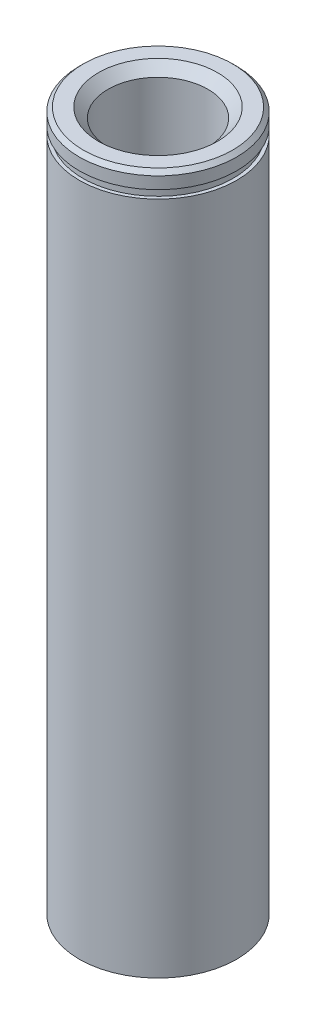
ISO-10303-21;
HEADER;
FILE_DESCRIPTION(('STEP AP214'),'2;1');
FILE_NAME('part.step','',(''),(''),'','','');
FILE_SCHEMA(('AUTOMOTIVE_DESIGN { 1 0 10303 214 1 1 1 1 }'));
ENDSEC;
DATA;
#1=APPLICATION_CONTEXT('core data for automotive mechanical design processes');
#2=APPLICATION_PROTOCOL_DEFINITION('international standard','automotive_design',2000,#1);
#3=PRODUCT_CONTEXT('',#1,'mechanical');
#4=PRODUCT('Part','Part','',(#3));
#5=PRODUCT_RELATED_PRODUCT_CATEGORY('part','',(#4));
#6=PRODUCT_DEFINITION_FORMATION('','',#4);
#7=PRODUCT_DEFINITION_CONTEXT('part definition',#1,'design');
#8=PRODUCT_DEFINITION('design','',#6,#7);
#9=PRODUCT_DEFINITION_SHAPE('','',#8);
#10=(LENGTH_UNIT() NAMED_UNIT(*) SI_UNIT(.MILLI.,.METRE.));
#11=(NAMED_UNIT(*) PLANE_ANGLE_UNIT() SI_UNIT($,.RADIAN.));
#12=(NAMED_UNIT(*) SI_UNIT($,.STERADIAN.) SOLID_ANGLE_UNIT());
#13=UNCERTAINTY_MEASURE_WITH_UNIT(LENGTH_MEASURE(1.E-05),#10,'distance_accuracy_value','');
#14=(GEOMETRIC_REPRESENTATION_CONTEXT(3) GLOBAL_UNCERTAINTY_ASSIGNED_CONTEXT((#13)) GLOBAL_UNIT_ASSIGNED_CONTEXT((#10,
#11,#12)) REPRESENTATION_CONTEXT('',''));
#15=CARTESIAN_POINT('',(0.,0.,0.));
#16=DIRECTION('',(0.,0.,1.));
#17=DIRECTION('',(1.,0.,0.));
#18=AXIS2_PLACEMENT_3D('',#15,#16,#17);
#19=CARTESIAN_POINT('',(0.,0.,0.));
#20=DIRECTION('',(0.,-1.,0.));
#21=DIRECTION('',(0.,0.,-1.));
#22=AXIS2_PLACEMENT_3D('',#19,#20,#21);
#23=CYLINDRICAL_SURFACE('',#22,6.35);
#24=CARTESIAN_POINT('',(0.,40.1733337072938,0.));
#25=DIRECTION('',(0.,1.,0.));
#26=DIRECTION('',(0.,0.,1.));
#27=AXIS2_PLACEMENT_3D('',#24,#25,#26);
#28=CIRCLE('',#27,6.35);
#29=CARTESIAN_POINT('',(0.,40.1733337072938,6.35));
#30=VERTEX_POINT('',#29);
#31=EDGE_CURVE('E120',#30,#30,#28,.F.);
#32=ORIENTED_EDGE('',*,*,#31,.F.);
#33=EDGE_LOOP('',(#32));
#34=FACE_BOUND('',#33,.T.);
#35=CARTESIAN_POINT('',(0.,0.,0.));
#36=DIRECTION('',(0.,-1.,0.));
#37=DIRECTION('',(0.,0.,-1.));
#38=AXIS2_PLACEMENT_3D('',#35,#36,#37);
#39=CIRCLE('',#38,6.35);
#40=CARTESIAN_POINT('',(0.,0.,-6.35));
#41=VERTEX_POINT('',#40);
#42=EDGE_CURVE('E121',#41,#41,#39,.T.);
#43=ORIENTED_EDGE('',*,*,#42,.T.);
#44=EDGE_LOOP('',(#43));
#45=FACE_BOUND('',#44,.T.);
#46=ADVANCED_FACE('F61',(#34,#45),#23,.F.);
#47=CARTESIAN_POINT('',(0.,110.97719994,-6.35));
#48=DIRECTION('',(0.,1.,0.));
#49=DIRECTION('',(0.,0.,1.));
#50=AXIS2_PLACEMENT_3D('',#47,#48,#49);
#51=PLANE('',#50);
#52=CARTESIAN_POINT('',(0.,110.97719994,0.));
#53=DIRECTION('',(0.,1.,0.));
#54=DIRECTION('',(0.,0.,1.));
#55=AXIS2_PLACEMENT_3D('',#52,#53,#54);
#56=CIRCLE('',#55,9.46149999999997);
#57=CARTESIAN_POINT('',(0.,110.97719994,9.46149999999997));
#58=VERTEX_POINT('',#57);
#59=EDGE_CURVE('E14',#58,#58,#56,.F.);
#60=ORIENTED_EDGE('',*,*,#59,.T.);
#61=EDGE_LOOP('',(#60));
#62=FACE_BOUND('',#61,.T.);
#63=CARTESIAN_POINT('',(0.,110.97719994,0.));
#64=DIRECTION('',(0.,1.,0.));
#65=DIRECTION('',(0.,0.,1.));
#66=AXIS2_PLACEMENT_3D('',#63,#64,#65);
#67=CIRCLE('',#66,11.865000019);
#68=CARTESIAN_POINT('',(0.,110.97719994,11.865000019));
#69=VERTEX_POINT('',#68);
#70=EDGE_CURVE('E144',#69,#69,#67,.T.);
#71=ORIENTED_EDGE('',*,*,#70,.T.);
#72=EDGE_LOOP('',(#71));
#73=FACE_BOUND('',#72,.T.);
#74=ADVANCED_FACE('F163',(#62,#73),#51,.T.);
#75=CARTESIAN_POINT('',(0.,0.,0.));
#76=DIRECTION('',(0.,-1.,0.));
#77=DIRECTION('',(0.,0.,-1.));
#78=AXIS2_PLACEMENT_3D('',#75,#76,#77);
#79=CYLINDRICAL_SURFACE('',#78,12.500000019);
#80=CARTESIAN_POINT('',(0.,110.34219994,0.));
#81=DIRECTION('',(0.,1.,0.));
#82=DIRECTION('',(0.,0.,1.));
#83=AXIS2_PLACEMENT_3D('',#80,#81,#82);
#84=CIRCLE('',#83,12.500000019);
#85=CARTESIAN_POINT('',(0.,110.34219994,12.500000019));
#86=VERTEX_POINT('',#85);
#87=EDGE_CURVE('E139',#86,#86,#84,.F.);
#88=ORIENTED_EDGE('',*,*,#87,.T.);
#89=EDGE_LOOP('',(#88));
#90=FACE_BOUND('',#89,.T.);
#91=CARTESIAN_POINT('',(0.,108.43719994,0.));
#92=DIRECTION('',(0.,-1.,0.));
#93=DIRECTION('',(0.,0.,-1.));
#94=AXIS2_PLACEMENT_3D('',#91,#92,#93);
#95=CIRCLE('',#94,12.500000019);
#96=CARTESIAN_POINT('',(0.,108.43719994,-12.500000019));
#97=VERTEX_POINT('',#96);
#98=EDGE_CURVE('E136',#97,#97,#95,.T.);
#99=ORIENTED_EDGE('',*,*,#98,.F.);
#100=EDGE_LOOP('',(#99));
#101=FACE_BOUND('',#100,.T.);
#102=ADVANCED_FACE('F169',(#90,#101),#79,.T.);
#103=CARTESIAN_POINT('',(0.,108.43719994,-12.500000019));
#104=DIRECTION('',(0.,-1.,0.));
#105=DIRECTION('',(0.,0.,-1.));
#106=AXIS2_PLACEMENT_3D('',#103,#104,#105);
#107=PLANE('',#106);
#108=ORIENTED_EDGE('',*,*,#98,.T.);
#109=EDGE_LOOP('',(#108));
#110=FACE_BOUND('',#109,.T.);
#111=CARTESIAN_POINT('',(0.,108.43719994,0.));
#112=DIRECTION('',(0.,-1.,0.));
#113=DIRECTION('',(0.,0.,-1.));
#114=AXIS2_PLACEMENT_3D('',#111,#112,#113);
#115=CIRCLE('',#114,11.949999976);
#116=CARTESIAN_POINT('',(0.,108.43719994,-11.949999976));
#117=VERTEX_POINT('',#116);
#118=EDGE_CURVE('E133',#117,#117,#115,.T.);
#119=ORIENTED_EDGE('',*,*,#118,.F.);
#120=EDGE_LOOP('',(#119));
#121=FACE_BOUND('',#120,.T.);
#122=ADVANCED_FACE('F193',(#110,#121),#107,.T.);
#123=CARTESIAN_POINT('',(0.,0.,0.));
#124=DIRECTION('',(0.,-1.,0.));
#125=DIRECTION('',(0.,0.,-1.));
#126=AXIS2_PLACEMENT_3D('',#123,#124,#125);
#127=CYLINDRICAL_SURFACE('',#126,11.949999976);
#128=ORIENTED_EDGE('',*,*,#118,.T.);
#129=EDGE_LOOP('',(#128));
#130=FACE_BOUND('',#129,.T.);
#131=CARTESIAN_POINT('',(0.,107.1372,0.));
#132=DIRECTION('',(0.,-1.,0.));
#133=DIRECTION('',(0.,0.,-1.));
#134=AXIS2_PLACEMENT_3D('',#131,#132,#133);
#135=CIRCLE('',#134,11.949999976);
#136=CARTESIAN_POINT('',(0.,107.1372,-11.949999976));
#137=VERTEX_POINT('',#136);
#138=EDGE_CURVE('E130',#137,#137,#135,.T.);
#139=ORIENTED_EDGE('',*,*,#138,.F.);
#140=EDGE_LOOP('',(#139));
#141=FACE_BOUND('',#140,.T.);
#142=ADVANCED_FACE('F198',(#130,#141),#127,.T.);
#143=CARTESIAN_POINT('',(0.,107.1372,-11.949999976));
#144=DIRECTION('',(0.,1.,0.));
#145=DIRECTION('',(0.,0.,1.));
#146=AXIS2_PLACEMENT_3D('',#143,#144,#145);
#147=PLANE('',#146);
#148=ORIENTED_EDGE('',*,*,#138,.T.);
#149=EDGE_LOOP('',(#148));
#150=FACE_BOUND('',#149,.T.);
#151=CARTESIAN_POINT('',(0.,107.1372,0.));
#152=DIRECTION('',(0.,-1.,0.));
#153=DIRECTION('',(0.,0.,-1.));
#154=AXIS2_PLACEMENT_3D('',#151,#152,#153);
#155=CIRCLE('',#154,12.500000019);
#156=CARTESIAN_POINT('',(0.,107.1372,-12.500000019));
#157=VERTEX_POINT('',#156);
#158=EDGE_CURVE('E127',#157,#157,#155,.T.);
#159=ORIENTED_EDGE('',*,*,#158,.F.);
#160=EDGE_LOOP('',(#159));
#161=FACE_BOUND('',#160,.T.);
#162=ADVANCED_FACE('F204',(#150,#161),#147,.T.);
#163=CARTESIAN_POINT('',(0.,0.,0.));
#164=DIRECTION('',(0.,-1.,0.));
#165=DIRECTION('',(0.,0.,-1.));
#166=AXIS2_PLACEMENT_3D('',#163,#164,#165);
#167=CYLINDRICAL_SURFACE('',#166,12.500000019);
#168=ORIENTED_EDGE('',*,*,#158,.T.);
#169=EDGE_LOOP('',(#168));
#170=FACE_BOUND('',#169,.T.);
#171=CARTESIAN_POINT('',(0.,0.,0.));
#172=DIRECTION('',(0.,-1.,0.));
#173=DIRECTION('',(0.,0.,-1.));
#174=AXIS2_PLACEMENT_3D('',#171,#172,#173);
#175=CIRCLE('',#174,12.500000019);
#176=CARTESIAN_POINT('',(0.,0.,-12.500000019));
#177=VERTEX_POINT('',#176);
#178=EDGE_CURVE('E124',#177,#177,#175,.T.);
#179=ORIENTED_EDGE('',*,*,#178,.F.);
#180=EDGE_LOOP('',(#179));
#181=FACE_BOUND('',#180,.T.);
#182=ADVANCED_FACE('F210',(#170,#181),#167,.T.);
#183=CARTESIAN_POINT('',(0.,0.,-6.35));
#184=DIRECTION('',(0.,-1.,0.));
#185=DIRECTION('',(0.,0.,-1.));
#186=AXIS2_PLACEMENT_3D('',#183,#184,#185);
#187=PLANE('',#186);
#188=CARTESIAN_POINT('',(-6.66448141940074,0.,6.66448141940071));
#189=DIRECTION('',(0.,-1.,0.));
#190=DIRECTION('',(0.,0.,-1.));
#191=AXIS2_PLACEMENT_3D('',#188,#189,#190);
#192=CIRCLE('',#191,2.36855000445998);
#193=CARTESIAN_POINT('',(-6.66448141940074,0.,4.29593141494073));
#194=VERTEX_POINT('',#193);
#195=EDGE_CURVE('E299',#194,#194,#192,.T.);
#196=ORIENTED_EDGE('',*,*,#195,.F.);
#197=EDGE_LOOP('',(#196));
#198=FACE_BOUND('',#197,.T.);
#199=CARTESIAN_POINT('',(-6.66448141940071,0.,-6.66448141940074));
#200=DIRECTION('',(0.,-1.,0.));
#201=DIRECTION('',(0.,0.,-1.));
#202=AXIS2_PLACEMENT_3D('',#199,#200,#201);
#203=CIRCLE('',#202,2.368550008388);
#204=CARTESIAN_POINT('',(-6.66448141940071,0.,-9.03303142778874));
#205=VERTEX_POINT('',#204);
#206=EDGE_CURVE('E293',#205,#205,#203,.T.);
#207=ORIENTED_EDGE('',*,*,#206,.F.);
#208=EDGE_LOOP('',(#207));
#209=FACE_BOUND('',#208,.T.);
#210=CARTESIAN_POINT('',(6.66448141940074,0.,-6.66448141940071));
#211=DIRECTION('',(0.,-1.,0.));
#212=DIRECTION('',(0.,0.,-1.));
#213=AXIS2_PLACEMENT_3D('',#210,#211,#212);
#214=CIRCLE('',#213,2.36854999554002);
#215=CARTESIAN_POINT('',(6.66448141940074,0.,-9.03303141494073));
#216=VERTEX_POINT('',#215);
#217=EDGE_CURVE('E284',#216,#216,#214,.T.);
#218=ORIENTED_EDGE('',*,*,#217,.F.);
#219=EDGE_LOOP('',(#218));
#220=FACE_BOUND('',#219,.T.);
#221=CARTESIAN_POINT('',(6.66448141940071,0.,6.66448141940074));
#222=DIRECTION('',(0.,-1.,0.));
#223=DIRECTION('',(0.,0.,-1.));
#224=AXIS2_PLACEMENT_3D('',#221,#222,#223);
#225=CIRCLE('',#224,2.368549991612);
#226=CARTESIAN_POINT('',(6.66448141940071,0.,4.29593142778874));
#227=VERTEX_POINT('',#226);
#228=EDGE_CURVE('E283',#227,#227,#225,.T.);
#229=ORIENTED_EDGE('',*,*,#228,.F.);
#230=EDGE_LOOP('',(#229));
#231=FACE_BOUND('',#230,.T.);
#232=CARTESIAN_POINT('',(0.,0.,9.4250000095));
#233=DIRECTION('',(0.,-1.,0.));
#234=DIRECTION('',(0.,0.,-1.));
#235=AXIS2_PLACEMENT_3D('',#232,#233,#234);
#236=CIRCLE('',#235,1.7272);
#237=CARTESIAN_POINT('',(0.,0.,7.6978000095));
#238=VERTEX_POINT('',#237);
#239=EDGE_CURVE('E93',#238,#238,#236,.T.);
#240=ORIENTED_EDGE('',*,*,#239,.F.);
#241=EDGE_LOOP('',(#240));
#242=FACE_BOUND('',#241,.T.);
#243=CARTESIAN_POINT('',(9.4250000095,0.,0.));
#244=DIRECTION('',(0.,-1.,0.));
#245=DIRECTION('',(0.,0.,-1.));
#246=AXIS2_PLACEMENT_3D('',#243,#244,#245);
#247=CIRCLE('',#246,1.7272);
#248=CARTESIAN_POINT('',(9.4250000095,0.,-1.7272));
#249=VERTEX_POINT('',#248);
#250=EDGE_CURVE('E92',#249,#249,#247,.T.);
#251=ORIENTED_EDGE('',*,*,#250,.F.);
#252=EDGE_LOOP('',(#251));
#253=FACE_BOUND('',#252,.T.);
#254=CARTESIAN_POINT('',(0.,0.,-9.4250000095));
#255=DIRECTION('',(0.,-1.,0.));
#256=DIRECTION('',(0.,0.,-1.));
#257=AXIS2_PLACEMENT_3D('',#254,#255,#256);
#258=CIRCLE('',#257,1.7272);
#259=CARTESIAN_POINT('',(0.,0.,-11.1522000095));
#260=VERTEX_POINT('',#259);
#261=EDGE_CURVE('E105',#260,#260,#258,.T.);
#262=ORIENTED_EDGE('',*,*,#261,.F.);
#263=EDGE_LOOP('',(#262));
#264=FACE_BOUND('',#263,.T.);
#265=CARTESIAN_POINT('',(-9.4250000095,0.,0.));
#266=DIRECTION('',(0.,-1.,0.));
#267=DIRECTION('',(0.,0.,-1.));
#268=AXIS2_PLACEMENT_3D('',#265,#266,#267);
#269=CIRCLE('',#268,1.7272);
#270=CARTESIAN_POINT('',(-9.4250000095,0.,-1.7272));
#271=VERTEX_POINT('',#270);
#272=EDGE_CURVE('E111',#271,#271,#269,.T.);
#273=ORIENTED_EDGE('',*,*,#272,.F.);
#274=EDGE_LOOP('',(#273));
#275=FACE_BOUND('',#274,.T.);
#276=ORIENTED_EDGE('',*,*,#178,.T.);
#277=EDGE_LOOP('',(#276));
#278=FACE_BOUND('',#277,.T.);
#279=ORIENTED_EDGE('',*,*,#42,.F.);
#280=EDGE_LOOP('',(#279));
#281=FACE_BOUND('',#280,.T.);
#282=ADVANCED_FACE('F216',(#198,#209,#220,#231,#242,#253,#264,#275,#278,#281),#187,.T.);
#283=CARTESIAN_POINT('',(0.,41.12719994,0.));
#284=DIRECTION('',(0.,1.,0.));
#285=DIRECTION('',(0.,0.,1.));
#286=AXIS2_PLACEMENT_3D('',#283,#284,#285);
#287=CONICAL_SURFACE('',#286,7.93749999999998,1.02974425867665);
#288=ORIENTED_EDGE('',*,*,#31,.T.);
#289=EDGE_LOOP('',(#288));
#290=FACE_BOUND('',#289,.T.);
#291=CARTESIAN_POINT('',(0.,41.12719994,0.));
#292=DIRECTION('',(0.,1.,0.));
#293=DIRECTION('',(0.,0.,1.));
#294=AXIS2_PLACEMENT_3D('',#291,#292,#293);
#295=CIRCLE('',#294,7.93749999999998);
#296=CARTESIAN_POINT('',(0.,41.12719994,7.93749999999998));
#297=VERTEX_POINT('',#296);
#298=EDGE_CURVE('E117',#297,#297,#295,.T.);
#299=ORIENTED_EDGE('',*,*,#298,.T.);
#300=EDGE_LOOP('',(#299));
#301=FACE_BOUND('',#300,.T.);
#302=ADVANCED_FACE('F185',(#290,#301),#287,.F.);
#303=CARTESIAN_POINT('',(0.,110.97719994,0.));
#304=DIRECTION('',(0.,1.,0.));
#305=DIRECTION('',(0.,0.,1.));
#306=AXIS2_PLACEMENT_3D('',#303,#304,#305);
#307=CYLINDRICAL_SURFACE('',#306,7.93749999999999);
#308=CARTESIAN_POINT('',(0.,109.45319994,0.));
#309=DIRECTION('',(0.,1.,0.));
#310=DIRECTION('',(0.,0.,1.));
#311=AXIS2_PLACEMENT_3D('',#308,#309,#310);
#312=CIRCLE('',#311,7.93749999999999);
#313=CARTESIAN_POINT('',(0.,109.45319994,7.93749999999999));
#314=VERTEX_POINT('',#313);
#315=EDGE_CURVE('E69',#314,#314,#312,.T.);
#316=ORIENTED_EDGE('',*,*,#315,.T.);
#317=EDGE_LOOP('',(#316));
#318=FACE_BOUND('',#317,.T.);
#319=ORIENTED_EDGE('',*,*,#298,.F.);
#320=EDGE_LOOP('',(#319));
#321=FACE_BOUND('',#320,.T.);
#322=ADVANCED_FACE('F149',(#318,#321),#307,.F.);
#323=CARTESIAN_POINT('',(0.,110.34219994,0.));
#324=DIRECTION('',(0.,-1.,0.));
#325=DIRECTION('',(0.,0.,-1.));
#326=AXIS2_PLACEMENT_3D('',#323,#324,#325);
#327=CONICAL_SURFACE('',#326,12.500000019,0.785398163397452);
#328=ORIENTED_EDGE('',*,*,#70,.F.);
#329=EDGE_LOOP('',(#328));
#330=FACE_BOUND('',#329,.T.);
#331=ORIENTED_EDGE('',*,*,#87,.F.);
#332=EDGE_LOOP('',(#331));
#333=FACE_BOUND('',#332,.T.);
#334=ADVANCED_FACE('F175',(#330,#333),#327,.T.);
#335=CARTESIAN_POINT('',(-9.4250000095,12.7,0.));
#336=DIRECTION('',(0.,-1.,0.));
#337=DIRECTION('',(0.,0.,-1.));
#338=AXIS2_PLACEMENT_3D('',#335,#336,#337);
#339=CONICAL_SURFACE('',#338,1.7272,1.02974425867665);
#340=CARTESIAN_POINT('',(-9.42500000950001,13.7378064611844,0.));
#341=VERTEX_POINT('',#340);
#342=VERTEX_LOOP('',#341);
#343=FACE_BOUND('',#342,.T.);
#344=CARTESIAN_POINT('',(-9.4250000095,12.7,0.));
#345=DIRECTION('',(0.,-1.,0.));
#346=DIRECTION('',(0.,0.,-1.));
#347=AXIS2_PLACEMENT_3D('',#344,#345,#346);
#348=CIRCLE('',#347,1.7272);
#349=CARTESIAN_POINT('',(-9.4250000095,12.7,-1.7272));
#350=VERTEX_POINT('',#349);
#351=EDGE_CURVE('E114',#350,#350,#348,.T.);
#352=ORIENTED_EDGE('',*,*,#351,.T.);
#353=EDGE_LOOP('',(#352));
#354=FACE_BOUND('',#353,.T.);
#355=ADVANCED_FACE('F177',(#343,#354),#339,.F.);
#356=CARTESIAN_POINT('',(-9.4250000095,0.,0.));
#357=DIRECTION('',(0.,-1.,0.));
#358=DIRECTION('',(0.,0.,-1.));
#359=AXIS2_PLACEMENT_3D('',#356,#357,#358);
#360=CYLINDRICAL_SURFACE('',#359,1.7272);
#361=ORIENTED_EDGE('',*,*,#351,.F.);
#362=EDGE_LOOP('',(#361));
#363=FACE_BOUND('',#362,.T.);
#364=ORIENTED_EDGE('',*,*,#272,.T.);
#365=EDGE_LOOP('',(#364));
#366=FACE_BOUND('',#365,.T.);
#367=ADVANCED_FACE('F183',(#363,#366),#360,.F.);
#368=CARTESIAN_POINT('',(0.,12.7,-9.4250000095));
#369=DIRECTION('',(0.,-1.,0.));
#370=DIRECTION('',(0.,0.,-1.));
#371=AXIS2_PLACEMENT_3D('',#368,#369,#370);
#372=CONICAL_SURFACE('',#371,1.7272,1.02974425867665);
#373=CARTESIAN_POINT('',(0.,13.7378064611844,-9.4250000095));
#374=VERTEX_POINT('',#373);
#375=VERTEX_LOOP('',#374);
#376=FACE_BOUND('',#375,.T.);
#377=CARTESIAN_POINT('',(0.,12.7,-9.4250000095));
#378=DIRECTION('',(0.,-1.,0.));
#379=DIRECTION('',(0.,0.,-1.));
#380=AXIS2_PLACEMENT_3D('',#377,#378,#379);
#381=CIRCLE('',#380,1.7272);
#382=CARTESIAN_POINT('',(0.,12.7,-11.1522000095));
#383=VERTEX_POINT('',#382);
#384=EDGE_CURVE('E108',#383,#383,#381,.T.);
#385=ORIENTED_EDGE('',*,*,#384,.T.);
#386=EDGE_LOOP('',(#385));
#387=FACE_BOUND('',#386,.T.);
#388=ADVANCED_FACE('F235',(#376,#387),#372,.F.);
#389=CARTESIAN_POINT('',(0.,0.,-9.4250000095));
#390=DIRECTION('',(0.,-1.,0.));
#391=DIRECTION('',(0.,0.,-1.));
#392=AXIS2_PLACEMENT_3D('',#389,#390,#391);
#393=CYLINDRICAL_SURFACE('',#392,1.7272);
#394=ORIENTED_EDGE('',*,*,#384,.F.);
#395=EDGE_LOOP('',(#394));
#396=FACE_BOUND('',#395,.T.);
#397=ORIENTED_EDGE('',*,*,#261,.T.);
#398=EDGE_LOOP('',(#397));
#399=FACE_BOUND('',#398,.T.);
#400=ADVANCED_FACE('F239',(#396,#399),#393,.F.);
#401=CARTESIAN_POINT('',(9.4250000095,12.7,0.));
#402=DIRECTION('',(0.,-1.,0.));
#403=DIRECTION('',(0.,0.,-1.));
#404=AXIS2_PLACEMENT_3D('',#401,#402,#403);
#405=CONICAL_SURFACE('',#404,1.7272,1.02974425867665);
#406=CARTESIAN_POINT('',(9.4250000095,13.7378064611844,0.));
#407=VERTEX_POINT('',#406);
#408=VERTEX_LOOP('',#407);
#409=FACE_BOUND('',#408,.T.);
#410=CARTESIAN_POINT('',(9.4250000095,12.7,0.));
#411=DIRECTION('',(0.,-1.,0.));
#412=DIRECTION('',(0.,0.,-1.));
#413=AXIS2_PLACEMENT_3D('',#410,#411,#412);
#414=CIRCLE('',#413,1.7272);
#415=CARTESIAN_POINT('',(9.4250000095,12.7,-1.7272));
#416=VERTEX_POINT('',#415);
#417=EDGE_CURVE('E96',#416,#416,#414,.T.);
#418=ORIENTED_EDGE('',*,*,#417,.T.);
#419=EDGE_LOOP('',(#418));
#420=FACE_BOUND('',#419,.T.);
#421=ADVANCED_FACE('F242',(#409,#420),#405,.F.);
#422=CARTESIAN_POINT('',(9.4250000095,0.,0.));
#423=DIRECTION('',(0.,-1.,0.));
#424=DIRECTION('',(0.,0.,-1.));
#425=AXIS2_PLACEMENT_3D('',#422,#423,#424);
#426=CYLINDRICAL_SURFACE('',#425,1.7272);
#427=ORIENTED_EDGE('',*,*,#417,.F.);
#428=EDGE_LOOP('',(#427));
#429=FACE_BOUND('',#428,.T.);
#430=ORIENTED_EDGE('',*,*,#250,.T.);
#431=EDGE_LOOP('',(#430));
#432=FACE_BOUND('',#431,.T.);
#433=ADVANCED_FACE('F86',(#429,#432),#426,.F.);
#434=CARTESIAN_POINT('',(0.,12.7,9.4250000095));
#435=DIRECTION('',(0.,-1.,0.));
#436=DIRECTION('',(0.,0.,-1.));
#437=AXIS2_PLACEMENT_3D('',#434,#435,#436);
#438=CONICAL_SURFACE('',#437,1.7272,1.02974425867665);
#439=CARTESIAN_POINT('',(0.,13.7378064611844,9.4250000095));
#440=VERTEX_POINT('',#439);
#441=VERTEX_LOOP('',#440);
#442=FACE_BOUND('',#441,.T.);
#443=CARTESIAN_POINT('',(0.,12.7,9.4250000095));
#444=DIRECTION('',(0.,-1.,0.));
#445=DIRECTION('',(0.,0.,-1.));
#446=AXIS2_PLACEMENT_3D('',#443,#444,#445);
#447=CIRCLE('',#446,1.7272);
#448=CARTESIAN_POINT('',(0.,12.7,7.6978000095));
#449=VERTEX_POINT('',#448);
#450=EDGE_CURVE('E90',#449,#449,#447,.T.);
#451=ORIENTED_EDGE('',*,*,#450,.T.);
#452=EDGE_LOOP('',(#451));
#453=FACE_BOUND('',#452,.T.);
#454=ADVANCED_FACE('F82',(#442,#453),#438,.F.);
#455=CARTESIAN_POINT('',(0.,0.,9.4250000095));
#456=DIRECTION('',(0.,-1.,0.));
#457=DIRECTION('',(0.,0.,-1.));
#458=AXIS2_PLACEMENT_3D('',#455,#456,#457);
#459=CYLINDRICAL_SURFACE('',#458,1.7272);
#460=ORIENTED_EDGE('',*,*,#450,.F.);
#461=EDGE_LOOP('',(#460));
#462=FACE_BOUND('',#461,.T.);
#463=ORIENTED_EDGE('',*,*,#239,.T.);
#464=EDGE_LOOP('',(#463));
#465=FACE_BOUND('',#464,.T.);
#466=ADVANCED_FACE('F85',(#462,#465),#459,.F.);
#467=CARTESIAN_POINT('',(6.66448141940071,12.7,6.66448141940074));
#468=DIRECTION('',(0.,-1.,0.));
#469=DIRECTION('',(0.,0.,-1.));
#470=AXIS2_PLACEMENT_3D('',#467,#468,#469);
#471=CYLINDRICAL_SURFACE('',#470,2.368549991612);
#472=CARTESIAN_POINT('',(6.66448141940071,12.7,6.66448141940074));
#473=DIRECTION('',(0.,-1.,0.));
#474=DIRECTION('',(0.,0.,-1.));
#475=AXIS2_PLACEMENT_3D('',#472,#473,#474);
#476=CIRCLE('',#475,2.368549991612);
#477=CARTESIAN_POINT('',(6.66448141940071,12.7,4.29593142778874));
#478=VERTEX_POINT('',#477);
#479=EDGE_CURVE('E99',#478,#478,#476,.T.);
#480=ORIENTED_EDGE('',*,*,#479,.F.);
#481=EDGE_LOOP('',(#480));
#482=FACE_BOUND('',#481,.T.);
#483=ORIENTED_EDGE('',*,*,#228,.T.);
#484=EDGE_LOOP('',(#483));
#485=FACE_BOUND('',#484,.T.);
#486=ADVANCED_FACE('F252',(#482,#485),#471,.F.);
#487=CARTESIAN_POINT('',(6.66448141940071,12.7,6.66448141940074));
#488=DIRECTION('',(0.,-1.,0.));
#489=DIRECTION('',(0.,0.,-1.));
#490=AXIS2_PLACEMENT_3D('',#487,#488,#489);
#491=PLANE('',#490);
#492=ORIENTED_EDGE('',*,*,#479,.T.);
#493=EDGE_LOOP('',(#492));
#494=FACE_BOUND('',#493,.T.);
#495=ADVANCED_FACE('F255',(#494),#491,.T.);
#496=CARTESIAN_POINT('',(6.66448141940074,12.7,-6.66448141940071));
#497=DIRECTION('',(0.,-1.,0.));
#498=DIRECTION('',(0.,0.,-1.));
#499=AXIS2_PLACEMENT_3D('',#496,#497,#498);
#500=CYLINDRICAL_SURFACE('',#499,2.36854999554002);
#501=CARTESIAN_POINT('',(6.66448141940074,12.7,-6.66448141940071));
#502=DIRECTION('',(0.,-1.,0.));
#503=DIRECTION('',(0.,0.,-1.));
#504=AXIS2_PLACEMENT_3D('',#501,#502,#503);
#505=CIRCLE('',#504,2.36854999554002);
#506=CARTESIAN_POINT('',(6.66448141940074,12.7,-9.03303141494073));
#507=VERTEX_POINT('',#506);
#508=EDGE_CURVE('E282',#507,#507,#505,.T.);
#509=ORIENTED_EDGE('',*,*,#508,.F.);
#510=EDGE_LOOP('',(#509));
#511=FACE_BOUND('',#510,.T.);
#512=ORIENTED_EDGE('',*,*,#217,.T.);
#513=EDGE_LOOP('',(#512));
#514=FACE_BOUND('',#513,.T.);
#515=ADVANCED_FACE('F259',(#511,#514),#500,.F.);
#516=CARTESIAN_POINT('',(6.66448141940074,12.7,-6.66448141940071));
#517=DIRECTION('',(0.,-1.,0.));
#518=DIRECTION('',(0.,0.,-1.));
#519=AXIS2_PLACEMENT_3D('',#516,#517,#518);
#520=PLANE('',#519);
#521=ORIENTED_EDGE('',*,*,#508,.T.);
#522=EDGE_LOOP('',(#521));
#523=FACE_BOUND('',#522,.T.);
#524=ADVANCED_FACE('F268',(#523),#520,.T.);
#525=CARTESIAN_POINT('',(-6.66448141940071,12.7,-6.66448141940074));
#526=DIRECTION('',(0.,-1.,0.));
#527=DIRECTION('',(0.,0.,-1.));
#528=AXIS2_PLACEMENT_3D('',#525,#526,#527);
#529=CYLINDRICAL_SURFACE('',#528,2.368550008388);
#530=CARTESIAN_POINT('',(-6.66448141940071,12.7,-6.66448141940074));
#531=DIRECTION('',(0.,-1.,0.));
#532=DIRECTION('',(0.,0.,-1.));
#533=AXIS2_PLACEMENT_3D('',#530,#531,#532);
#534=CIRCLE('',#533,2.368550008388);
#535=CARTESIAN_POINT('',(-6.66448141940071,12.7,-9.03303142778874));
#536=VERTEX_POINT('',#535);
#537=EDGE_CURVE('E288',#536,#536,#534,.T.);
#538=ORIENTED_EDGE('',*,*,#537,.F.);
#539=EDGE_LOOP('',(#538));
#540=FACE_BOUND('',#539,.T.);
#541=ORIENTED_EDGE('',*,*,#206,.T.);
#542=EDGE_LOOP('',(#541));
#543=FACE_BOUND('',#542,.T.);
#544=ADVANCED_FACE('F265',(#540,#543),#529,.F.);
#545=CARTESIAN_POINT('',(-6.66448141940071,12.7,-6.66448141940074));
#546=DIRECTION('',(0.,-1.,0.));
#547=DIRECTION('',(0.,0.,-1.));
#548=AXIS2_PLACEMENT_3D('',#545,#546,#547);
#549=PLANE('',#548);
#550=ORIENTED_EDGE('',*,*,#537,.T.);
#551=EDGE_LOOP('',(#550));
#552=FACE_BOUND('',#551,.T.);
#553=ADVANCED_FACE('F262',(#552),#549,.T.);
#554=CARTESIAN_POINT('',(-6.66448141940074,12.7,6.66448141940071));
#555=DIRECTION('',(0.,-1.,0.));
#556=DIRECTION('',(0.,0.,-1.));
#557=AXIS2_PLACEMENT_3D('',#554,#555,#556);
#558=CYLINDRICAL_SURFACE('',#557,2.36855000445998);
#559=CARTESIAN_POINT('',(-6.66448141940074,12.7,6.66448141940071));
#560=DIRECTION('',(0.,-1.,0.));
#561=DIRECTION('',(0.,0.,-1.));
#562=AXIS2_PLACEMENT_3D('',#559,#560,#561);
#563=CIRCLE('',#562,2.36855000445998);
#564=CARTESIAN_POINT('',(-6.66448141940074,12.7,4.29593141494073));
#565=VERTEX_POINT('',#564);
#566=EDGE_CURVE('E296',#565,#565,#563,.T.);
#567=ORIENTED_EDGE('',*,*,#566,.F.);
#568=EDGE_LOOP('',(#567));
#569=FACE_BOUND('',#568,.T.);
#570=ORIENTED_EDGE('',*,*,#195,.T.);
#571=EDGE_LOOP('',(#570));
#572=FACE_BOUND('',#571,.T.);
#573=ADVANCED_FACE('F158',(#569,#572),#558,.F.);
#574=CARTESIAN_POINT('',(-6.66448141940074,12.7,6.66448141940071));
#575=DIRECTION('',(0.,-1.,0.));
#576=DIRECTION('',(0.,0.,-1.));
#577=AXIS2_PLACEMENT_3D('',#574,#575,#576);
#578=PLANE('',#577);
#579=ORIENTED_EDGE('',*,*,#566,.T.);
#580=EDGE_LOOP('',(#579));
#581=FACE_BOUND('',#580,.T.);
#582=ADVANCED_FACE('F153',(#581),#578,.T.);
#583=CARTESIAN_POINT('',(0.,109.45319994,0.));
#584=DIRECTION('',(0.,1.,0.));
#585=DIRECTION('',(0.,0.,1.));
#586=AXIS2_PLACEMENT_3D('',#583,#584,#585);
#587=CONICAL_SURFACE('',#586,7.93749999999999,0.785398163397453);
#588=ORIENTED_EDGE('',*,*,#59,.F.);
#589=EDGE_LOOP('',(#588));
#590=FACE_BOUND('',#589,.T.);
#591=ORIENTED_EDGE('',*,*,#315,.F.);
#592=EDGE_LOOP('',(#591));
#593=FACE_BOUND('',#592,.T.);
#594=ADVANCED_FACE('F63',(#590,#593),#587,.F.);
#595=CLOSED_SHELL('',(#46,#74,#102,#122,#142,#162,#182,#282,#302,#322,#334,#355,#367,#388,#400,
#421,#433,#454,#466,#486,#495,#515,#524,#544,#553,#573,#582,#594));
#596=MANIFOLD_SOLID_BREP('B2',#595);
#597=ADVANCED_BREP_SHAPE_REPRESENTATION('',(#18,#596),#14);
#598=SHAPE_DEFINITION_REPRESENTATION(#9,#597);
ENDSEC;
END-ISO-10303-21;
